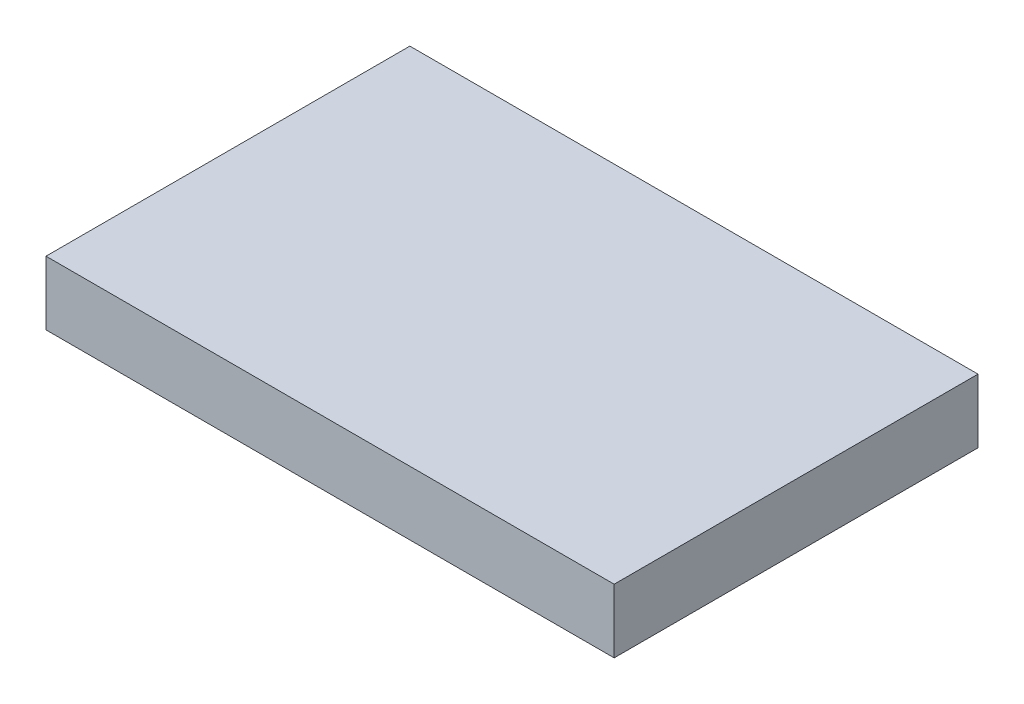
ISO-10303-21;
HEADER;
FILE_DESCRIPTION(('STEP AP214'),'2;1');
FILE_NAME('part.step','',(''),(''),'','','');
FILE_SCHEMA(('AUTOMOTIVE_DESIGN { 1 0 10303 214 1 1 1 1 }'));
ENDSEC;
DATA;
#1=APPLICATION_CONTEXT('core data for automotive mechanical design processes');
#2=APPLICATION_PROTOCOL_DEFINITION('international standard','automotive_design',2000,#1);
#3=PRODUCT_CONTEXT('',#1,'mechanical');
#4=PRODUCT('Part','Part','',(#3));
#5=PRODUCT_RELATED_PRODUCT_CATEGORY('part','',(#4));
#6=PRODUCT_DEFINITION_FORMATION('','',#4);
#7=PRODUCT_DEFINITION_CONTEXT('part definition',#1,'design');
#8=PRODUCT_DEFINITION('design','',#6,#7);
#9=PRODUCT_DEFINITION_SHAPE('','',#8);
#10=(LENGTH_UNIT() NAMED_UNIT(*) SI_UNIT(.MILLI.,.METRE.));
#11=(NAMED_UNIT(*) PLANE_ANGLE_UNIT() SI_UNIT($,.RADIAN.));
#12=(NAMED_UNIT(*) SI_UNIT($,.STERADIAN.) SOLID_ANGLE_UNIT());
#13=UNCERTAINTY_MEASURE_WITH_UNIT(LENGTH_MEASURE(1.E-05),#10,'distance_accuracy_value','');
#14=(GEOMETRIC_REPRESENTATION_CONTEXT(3) GLOBAL_UNCERTAINTY_ASSIGNED_CONTEXT((#13)) GLOBAL_UNIT_ASSIGNED_CONTEXT((#10,
#11,#12)) REPRESENTATION_CONTEXT('',''));
#15=CARTESIAN_POINT('',(0.,0.,0.));
#16=DIRECTION('',(0.,0.,1.));
#17=DIRECTION('',(1.,0.,0.));
#18=AXIS2_PLACEMENT_3D('',#15,#16,#17);
#19=CARTESIAN_POINT('',(-49.0317195325543,10.,-30.8497495826377));
#20=DIRECTION('',(1.,0.,0.));
#21=DIRECTION('',(0.,0.,-1.));
#22=AXIS2_PLACEMENT_3D('',#19,#20,#21);
#23=PLANE('',#22);
#24=DIRECTION('',(0.,0.,1.));
#25=VECTOR('',#24,1.);
#26=CARTESIAN_POINT('',(-49.0317195325543,0.,-30.8497495826377));
#27=LINE('',#26,#25);
#28=CARTESIAN_POINT('',(-49.0317195325543,0.,-30.8497495826377));
#29=VERTEX_POINT('',#28);
#30=CARTESIAN_POINT('',(-49.0317195325543,0.,26.1502504173623));
#31=VERTEX_POINT('',#30);
#32=EDGE_CURVE('E107',#29,#31,#27,.T.);
#33=ORIENTED_EDGE('',*,*,#32,.T.);
#34=DIRECTION('',(0.,-1.,0.));
#35=VECTOR('',#34,1.);
#36=CARTESIAN_POINT('',(-49.0317195325543,10.,26.1502504173623));
#37=LINE('',#36,#35);
#38=CARTESIAN_POINT('',(-49.0317195325543,10.,26.1502504173623));
#39=VERTEX_POINT('',#38);
#40=EDGE_CURVE('E11',#39,#31,#37,.T.);
#41=ORIENTED_EDGE('',*,*,#40,.F.);
#42=DIRECTION('',(0.,0.,1.));
#43=VECTOR('',#42,1.);
#44=CARTESIAN_POINT('',(-49.0317195325543,10.,-30.8497495826377));
#45=LINE('',#44,#43);
#46=CARTESIAN_POINT('',(-49.0317195325543,10.,-30.8497495826377));
#47=VERTEX_POINT('',#46);
#48=EDGE_CURVE('E91',#47,#39,#45,.T.);
#49=ORIENTED_EDGE('',*,*,#48,.F.);
#50=DIRECTION('',(0.,-1.,0.));
#51=VECTOR('',#50,1.);
#52=CARTESIAN_POINT('',(-49.0317195325543,10.,-30.8497495826377));
#53=LINE('',#52,#51);
#54=EDGE_CURVE('E103',#47,#29,#53,.T.);
#55=ORIENTED_EDGE('',*,*,#54,.T.);
#56=EDGE_LOOP('',(#33,#41,#49,#55));
#57=FACE_BOUND('',#56,.T.);
#58=ADVANCED_FACE('F39',(#57),#23,.F.);
#59=CARTESIAN_POINT('',(-49.0317195325543,10.,26.1502504173623));
#60=DIRECTION('',(0.,0.,-1.));
#61=DIRECTION('',(-1.,0.,0.));
#62=AXIS2_PLACEMENT_3D('',#59,#60,#61);
#63=PLANE('',#62);
#64=DIRECTION('',(1.,0.,0.));
#65=VECTOR('',#64,1.);
#66=CARTESIAN_POINT('',(-49.0317195325543,0.,26.1502504173623));
#67=LINE('',#66,#65);
#68=CARTESIAN_POINT('',(39.9682804674457,0.,26.1502504173623));
#69=VERTEX_POINT('',#68);
#70=EDGE_CURVE('E96',#31,#69,#67,.T.);
#71=ORIENTED_EDGE('',*,*,#70,.T.);
#72=DIRECTION('',(0.,-1.,0.));
#73=VECTOR('',#72,1.);
#74=CARTESIAN_POINT('',(39.9682804674457,10.,26.1502504173623));
#75=LINE('',#74,#73);
#76=CARTESIAN_POINT('',(39.9682804674457,10.,26.1502504173623));
#77=VERTEX_POINT('',#76);
#78=EDGE_CURVE('E48',#77,#69,#75,.T.);
#79=ORIENTED_EDGE('',*,*,#78,.F.);
#80=DIRECTION('',(1.,0.,0.));
#81=VECTOR('',#80,1.);
#82=CARTESIAN_POINT('',(-49.0317195325543,10.,26.1502504173623));
#83=LINE('',#82,#81);
#84=EDGE_CURVE('E86',#39,#77,#83,.T.);
#85=ORIENTED_EDGE('',*,*,#84,.F.);
#86=ORIENTED_EDGE('',*,*,#40,.T.);
#87=EDGE_LOOP('',(#71,#79,#85,#86));
#88=FACE_BOUND('',#87,.T.);
#89=ADVANCED_FACE('F95',(#88),#63,.F.);
#90=CARTESIAN_POINT('',(39.9682804674457,10.,-30.8497495826377));
#91=DIRECTION('',(-1.,0.,0.));
#92=DIRECTION('',(0.,0.,1.));
#93=AXIS2_PLACEMENT_3D('',#90,#91,#92);
#94=PLANE('',#93);
#95=DIRECTION('',(0.,0.,-1.));
#96=VECTOR('',#95,1.);
#97=CARTESIAN_POINT('',(39.9682804674457,0.,-30.8497495826377));
#98=LINE('',#97,#96);
#99=CARTESIAN_POINT('',(39.9682804674457,0.,-30.8497495826377));
#100=VERTEX_POINT('',#99);
#101=EDGE_CURVE('E73',#69,#100,#98,.T.);
#102=ORIENTED_EDGE('',*,*,#101,.T.);
#103=DIRECTION('',(0.,-1.,0.));
#104=VECTOR('',#103,1.);
#105=CARTESIAN_POINT('',(39.9682804674457,10.,-30.8497495826377));
#106=LINE('',#105,#104);
#107=CARTESIAN_POINT('',(39.9682804674457,10.,-30.8497495826377));
#108=VERTEX_POINT('',#107);
#109=EDGE_CURVE('E98',#108,#100,#106,.T.);
#110=ORIENTED_EDGE('',*,*,#109,.F.);
#111=DIRECTION('',(0.,0.,-1.));
#112=VECTOR('',#111,1.);
#113=CARTESIAN_POINT('',(39.9682804674457,10.,-30.8497495826377));
#114=LINE('',#113,#112);
#115=EDGE_CURVE('E89',#77,#108,#114,.T.);
#116=ORIENTED_EDGE('',*,*,#115,.F.);
#117=ORIENTED_EDGE('',*,*,#78,.T.);
#118=EDGE_LOOP('',(#102,#110,#116,#117));
#119=FACE_BOUND('',#118,.T.);
#120=ADVANCED_FACE('F99',(#119),#94,.F.);
#121=CARTESIAN_POINT('',(-49.0317195325543,10.,-30.8497495826377));
#122=DIRECTION('',(0.,0.,1.));
#123=DIRECTION('',(1.,0.,0.));
#124=AXIS2_PLACEMENT_3D('',#121,#122,#123);
#125=PLANE('',#124);
#126=DIRECTION('',(-1.,0.,0.));
#127=VECTOR('',#126,1.);
#128=CARTESIAN_POINT('',(-49.0317195325543,0.,-30.8497495826377));
#129=LINE('',#128,#127);
#130=EDGE_CURVE('E79',#100,#29,#129,.T.);
#131=ORIENTED_EDGE('',*,*,#130,.T.);
#132=ORIENTED_EDGE('',*,*,#54,.F.);
#133=DIRECTION('',(-1.,0.,0.));
#134=VECTOR('',#133,1.);
#135=CARTESIAN_POINT('',(-49.0317195325543,10.,-30.8497495826377));
#136=LINE('',#135,#134);
#137=EDGE_CURVE('E56',#108,#47,#136,.T.);
#138=ORIENTED_EDGE('',*,*,#137,.F.);
#139=ORIENTED_EDGE('',*,*,#109,.T.);
#140=EDGE_LOOP('',(#131,#132,#138,#139));
#141=FACE_BOUND('',#140,.T.);
#142=ADVANCED_FACE('F120',(#141),#125,.F.);
#143=CARTESIAN_POINT('',(0.,10.,0.));
#144=DIRECTION('',(0.,1.,0.));
#145=DIRECTION('',(0.,0.,1.));
#146=AXIS2_PLACEMENT_3D('',#143,#144,#145);
#147=PLANE('',#146);
#148=ORIENTED_EDGE('',*,*,#48,.T.);
#149=ORIENTED_EDGE('',*,*,#84,.T.);
#150=ORIENTED_EDGE('',*,*,#115,.T.);
#151=ORIENTED_EDGE('',*,*,#137,.T.);
#152=EDGE_LOOP('',(#148,#149,#150,#151));
#153=FACE_BOUND('',#152,.T.);
#154=ADVANCED_FACE('F87',(#153),#147,.T.);
#155=CARTESIAN_POINT('',(0.,0.,0.));
#156=DIRECTION('',(0.,1.,0.));
#157=DIRECTION('',(0.,0.,1.));
#158=AXIS2_PLACEMENT_3D('',#155,#156,#157);
#159=PLANE('',#158);
#160=ORIENTED_EDGE('',*,*,#32,.F.);
#161=ORIENTED_EDGE('',*,*,#130,.F.);
#162=ORIENTED_EDGE('',*,*,#101,.F.);
#163=ORIENTED_EDGE('',*,*,#70,.F.);
#164=EDGE_LOOP('',(#160,#161,#162,#163));
#165=FACE_BOUND('',#164,.T.);
#166=ADVANCED_FACE('F123',(#165),#159,.F.);
#167=CLOSED_SHELL('',(#58,#89,#120,#142,#154,#166));
#168=MANIFOLD_SOLID_BREP('B2',#167);
#169=ADVANCED_BREP_SHAPE_REPRESENTATION('',(#18,#168),#14);
#170=SHAPE_DEFINITION_REPRESENTATION(#9,#169);
ENDSEC;
END-ISO-10303-21;
